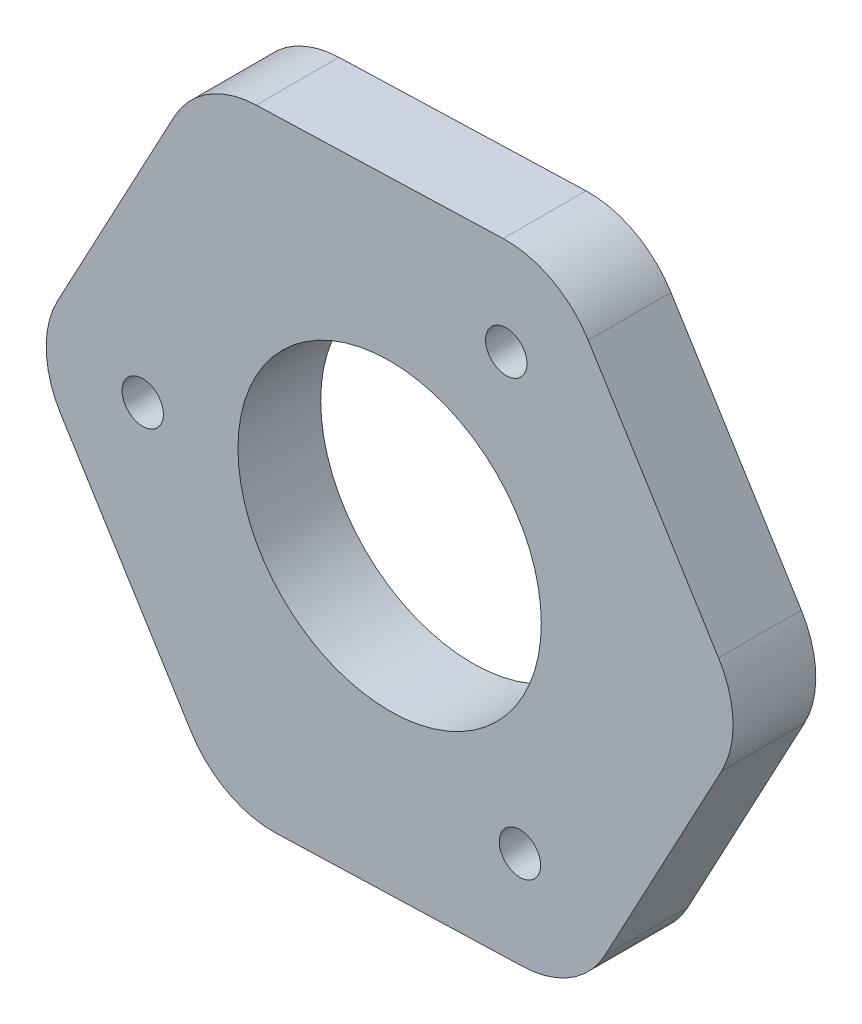
ISO-10303-21;
HEADER;
FILE_DESCRIPTION(('STEP AP214'),'2;1');
FILE_NAME('part.step','',(''),(''),'','','');
FILE_SCHEMA(('AUTOMOTIVE_DESIGN { 1 0 10303 214 1 1 1 1 }'));
ENDSEC;
DATA;
#1=APPLICATION_CONTEXT('core data for automotive mechanical design processes');
#2=APPLICATION_PROTOCOL_DEFINITION('international standard','automotive_design',2000,#1);
#3=PRODUCT_CONTEXT('',#1,'mechanical');
#4=PRODUCT('Part','Part','',(#3));
#5=PRODUCT_RELATED_PRODUCT_CATEGORY('part','',(#4));
#6=PRODUCT_DEFINITION_FORMATION('','',#4);
#7=PRODUCT_DEFINITION_CONTEXT('part definition',#1,'design');
#8=PRODUCT_DEFINITION('design','',#6,#7);
#9=PRODUCT_DEFINITION_SHAPE('','',#8);
#10=(LENGTH_UNIT() NAMED_UNIT(*) SI_UNIT(.MILLI.,.METRE.));
#11=(NAMED_UNIT(*) PLANE_ANGLE_UNIT() SI_UNIT($,.RADIAN.));
#12=(NAMED_UNIT(*) SI_UNIT($,.STERADIAN.) SOLID_ANGLE_UNIT());
#13=UNCERTAINTY_MEASURE_WITH_UNIT(LENGTH_MEASURE(1.E-05),#10,'distance_accuracy_value','');
#14=(GEOMETRIC_REPRESENTATION_CONTEXT(3) GLOBAL_UNCERTAINTY_ASSIGNED_CONTEXT((#13)) GLOBAL_UNIT_ASSIGNED_CONTEXT((#10,
#11,#12)) REPRESENTATION_CONTEXT('',''));
#15=CARTESIAN_POINT('',(0.,0.,0.));
#16=DIRECTION('',(0.,0.,1.));
#17=DIRECTION('',(1.,0.,0.));
#18=AXIS2_PLACEMENT_3D('',#15,#16,#17);
#19=CARTESIAN_POINT('',(30.4001110546183,357.597647719878,6.));
#20=DIRECTION('',(0.,0.,1.));
#21=DIRECTION('',(1.,0.,0.));
#22=AXIS2_PLACEMENT_3D('',#19,#20,#21);
#23=PLANE('',#22);
#24=CARTESIAN_POINT('',(56.7654750880517,373.96635541091,6.));
#25=DIRECTION('',(0.,0.,1.));
#26=DIRECTION('',(1.,0.,0.));
#27=AXIS2_PLACEMENT_3D('',#24,#25,#26);
#28=CIRCLE('',#27,1.49999999999958);
#29=CARTESIAN_POINT('',(58.2654750880513,373.96635541091,6.));
#30=VERTEX_POINT('',#29);
#31=EDGE_CURVE('E298',#30,#30,#28,.T.);
#32=ORIENTED_EDGE('',*,*,#31,.F.);
#33=EDGE_LOOP('',(#32));
#34=FACE_BOUND('',#33,.T.);
#35=CARTESIAN_POINT('',(57.7585097588884,342.948926532415,6.));
#36=DIRECTION('',(0.,0.,1.));
#37=DIRECTION('',(1.,0.,0.));
#38=AXIS2_PLACEMENT_3D('',#35,#36,#37);
#39=CIRCLE('',#38,1.50000000000005);
#40=CARTESIAN_POINT('',(59.2585097588884,342.948926532415,6.));
#41=VERTEX_POINT('',#40);
#42=EDGE_CURVE('E165',#41,#41,#39,.T.);
#43=ORIENTED_EDGE('',*,*,#42,.F.);
#44=EDGE_LOOP('',(#43));
#45=FACE_BOUND('',#44,.T.);
#46=CARTESIAN_POINT('',(30.4001110546183,357.597647719878,6.));
#47=DIRECTION('',(0.,0.,1.));
#48=DIRECTION('',(1.,0.,0.));
#49=AXIS2_PLACEMENT_3D('',#46,#47,#48);
#50=CIRCLE('',#49,7.00000000000114);
#51=CARTESIAN_POINT('',(24.229041224556,360.901871857632,6.));
#52=VERTEX_POINT('',#51);
#53=CARTESIAN_POINT('',(24.4530340964946,353.905456547395,6.));
#54=VERTEX_POINT('',#53);
#55=EDGE_CURVE('E184',#52,#54,#50,.T.);
#56=ORIENTED_EDGE('',*,*,#55,.T.);
#57=DIRECTION('',(0.527455881783461,-0.849582422588904,0.));
#58=VECTOR('',#57,1.);
#59=CARTESIAN_POINT('',(24.4530340964946,353.905456547395,6.));
#60=LINE('',#59,#58);
#61=CARTESIAN_POINT('',(33.9035118881977,338.68340652541,6.));
#62=VERTEX_POINT('',#61);
#63=EDGE_CURVE('E112',#54,#62,#60,.T.);
#64=ORIENTED_EDGE('',*,*,#63,.T.);
#65=CARTESIAN_POINT('',(39.8505888463207,342.375597697894,6.));
#66=DIRECTION('',(0.,0.,1.));
#67=DIRECTION('',(1.,0.,0.));
#68=AXIS2_PLACEMENT_3D('',#65,#66,#67);
#69=CIRCLE('',#68,7.00000000000067);
#70=CARTESIAN_POINT('',(40.0745817182586,335.379182387656,6.));
#71=VERTEX_POINT('',#70);
#72=EDGE_CURVE('E211',#62,#71,#69,.T.);
#73=ORIENTED_EDGE('',*,*,#72,.T.);
#74=DIRECTION('',(0.999487901462451,0.0319989817054624,0.));
#75=VECTOR('',#74,1.);
#76=CARTESIAN_POINT('',(40.0745817182587,335.379182387656,6.));
#77=LINE('',#76,#75);
#78=CARTESIAN_POINT('',(57.9825026308267,335.952511222178,6.));
#79=VERTEX_POINT('',#78);
#80=EDGE_CURVE('E230',#71,#79,#77,.T.);
#81=ORIENTED_EDGE('',*,*,#80,.T.);
#82=CARTESIAN_POINT('',(57.7585097588884,342.948926532415,6.));
#83=DIRECTION('',(0.,0.,1.));
#84=DIRECTION('',(1.,0.,0.));
#85=AXIS2_PLACEMENT_3D('',#82,#83,#84);
#86=CIRCLE('',#85,7.00000000000017);
#87=CARTESIAN_POINT('',(63.9295795889497,339.644702394662,6.));
#88=VERTEX_POINT('',#87);
#89=EDGE_CURVE('E227',#79,#88,#86,.T.);
#90=ORIENTED_EDGE('',*,*,#89,.T.);
#91=DIRECTION('',(0.472032019679086,0.881581404294398,0.));
#92=VECTOR('',#91,1.);
#93=CARTESIAN_POINT('',(63.9295795889496,339.644702394662,6.));
#94=LINE('',#93,#92);
#95=CARTESIAN_POINT('',(72.3870227098161,355.440081251169,6.));
#96=VERTEX_POINT('',#95);
#97=EDGE_CURVE('E229',#88,#96,#94,.T.);
#98=ORIENTED_EDGE('',*,*,#97,.T.);
#99=CARTESIAN_POINT('',(66.2159528797534,358.744305388923,6.));
#100=DIRECTION('',(0.,0.,1.));
#101=DIRECTION('',(1.,0.,0.));
#102=AXIS2_PLACEMENT_3D('',#99,#100,#101);
#103=CIRCLE('',#102,7.00000000000172);
#104=CARTESIAN_POINT('',(72.163029837878,362.436496561407,6.));
#105=VERTEX_POINT('',#104);
#106=EDGE_CURVE('E232',#96,#105,#103,.T.);
#107=ORIENTED_EDGE('',*,*,#106,.T.);
#108=DIRECTION('',(-0.527455881783443,0.849582422588916,0.));
#109=VECTOR('',#108,1.);
#110=CARTESIAN_POINT('',(72.163029837878,362.436496561407,6.));
#111=LINE('',#110,#109);
#112=CARTESIAN_POINT('',(62.7125520461742,377.658546583393,6.));
#113=VERTEX_POINT('',#112);
#114=EDGE_CURVE('E238',#105,#113,#111,.T.);
#115=ORIENTED_EDGE('',*,*,#114,.T.);
#116=CARTESIAN_POINT('',(56.7654750880518,373.966355410908,6.));
#117=DIRECTION('',(0.,0.,1.));
#118=DIRECTION('',(1.,0.,0.));
#119=AXIS2_PLACEMENT_3D('',#116,#117,#118);
#120=CIRCLE('',#119,7.00000000000107);
#121=CARTESIAN_POINT('',(56.5414822161133,380.962770721146,6.));
#122=VERTEX_POINT('',#121);
#123=EDGE_CURVE('E143',#113,#122,#120,.T.);
#124=ORIENTED_EDGE('',*,*,#123,.T.);
#125=DIRECTION('',(-0.99948790146245,-0.0319989817054965,0.));
#126=VECTOR('',#125,1.);
#127=CARTESIAN_POINT('',(56.5414822161133,380.962770721147,6.));
#128=LINE('',#127,#126);
#129=CARTESIAN_POINT('',(38.633561303547,380.389441886625,6.));
#130=VERTEX_POINT('',#129);
#131=EDGE_CURVE('E137',#122,#130,#128,.T.);
#132=ORIENTED_EDGE('',*,*,#131,.T.);
#133=CARTESIAN_POINT('',(38.8575541754844,373.393026576387,6.));
#134=DIRECTION('',(0.,0.,1.));
#135=DIRECTION('',(1.,0.,0.));
#136=AXIS2_PLACEMENT_3D('',#133,#134,#135);
#137=CIRCLE('',#136,7.00000000000034);
#138=CARTESIAN_POINT('',(32.6864843454236,376.697250714141,6.));
#139=VERTEX_POINT('',#138);
#140=EDGE_CURVE('E141',#130,#139,#137,.T.);
#141=ORIENTED_EDGE('',*,*,#140,.T.);
#142=DIRECTION('',(-0.472032019679114,-0.881581404294383,0.));
#143=VECTOR('',#142,1.);
#144=CARTESIAN_POINT('',(32.6864843454239,376.697250714141,6.));
#145=LINE('',#144,#143);
#146=EDGE_CURVE('E57',#139,#52,#145,.T.);
#147=ORIENTED_EDGE('',*,*,#146,.T.);
#148=EDGE_LOOP('',(#56,#64,#73,#81,#90,#98,#107,#115,#124,#132,#141,#147));
#149=FACE_BOUND('',#148,.T.);
#150=CARTESIAN_POINT('',(48.3080319671867,358.170976554401,6.));
#151=DIRECTION('',(0.,0.,1.));
#152=DIRECTION('',(1.,0.,0.));
#153=AXIS2_PLACEMENT_3D('',#150,#151,#152);
#154=CIRCLE('',#153,10.999999999999);
#155=CARTESIAN_POINT('',(59.3080319671857,358.170976554401,6.));
#156=VERTEX_POINT('',#155);
#157=EDGE_CURVE('E304',#156,#156,#154,.T.);
#158=ORIENTED_EDGE('',*,*,#157,.F.);
#159=EDGE_LOOP('',(#158));
#160=FACE_BOUND('',#159,.T.);
#161=CARTESIAN_POINT('',(30.4001110546172,357.597647719879,6.));
#162=DIRECTION('',(0.,0.,1.));
#163=DIRECTION('',(1.,0.,0.));
#164=AXIS2_PLACEMENT_3D('',#161,#162,#163);
#165=CIRCLE('',#164,1.50000000000103);
#166=CARTESIAN_POINT('',(31.9001110546183,357.597647719879,6.));
#167=VERTEX_POINT('',#166);
#168=EDGE_CURVE('E289',#167,#167,#165,.T.);
#169=ORIENTED_EDGE('',*,*,#168,.F.);
#170=EDGE_LOOP('',(#169));
#171=FACE_BOUND('',#170,.T.);
#172=ADVANCED_FACE('F40',(#34,#45,#149,#160,#171),#23,.T.);
#173=CARTESIAN_POINT('',(30.4001110546183,357.597647719878,0.));
#174=DIRECTION('',(0.,0.,1.));
#175=DIRECTION('',(1.,0.,0.));
#176=AXIS2_PLACEMENT_3D('',#173,#174,#175);
#177=PLANE('',#176);
#178=CARTESIAN_POINT('',(30.4001110546183,357.597647719878,0.));
#179=DIRECTION('',(0.,0.,1.));
#180=DIRECTION('',(1.,0.,0.));
#181=AXIS2_PLACEMENT_3D('',#178,#179,#180);
#182=CIRCLE('',#181,7.00000000000114);
#183=CARTESIAN_POINT('',(24.229041224556,360.901871857632,0.));
#184=VERTEX_POINT('',#183);
#185=CARTESIAN_POINT('',(24.4530340964946,353.905456547395,0.));
#186=VERTEX_POINT('',#185);
#187=EDGE_CURVE('E161',#184,#186,#182,.T.);
#188=ORIENTED_EDGE('',*,*,#187,.F.);
#189=DIRECTION('',(-0.472032019679114,-0.881581404294383,0.));
#190=VECTOR('',#189,1.);
#191=CARTESIAN_POINT('',(32.6864843454239,376.697250714141,0.));
#192=LINE('',#191,#190);
#193=CARTESIAN_POINT('',(32.6864843454236,376.697250714141,0.));
#194=VERTEX_POINT('',#193);
#195=EDGE_CURVE('E104',#194,#184,#192,.T.);
#196=ORIENTED_EDGE('',*,*,#195,.F.);
#197=CARTESIAN_POINT('',(38.8575541754844,373.393026576387,0.));
#198=DIRECTION('',(0.,0.,1.));
#199=DIRECTION('',(1.,0.,0.));
#200=AXIS2_PLACEMENT_3D('',#197,#198,#199);
#201=CIRCLE('',#200,7.00000000000034);
#202=CARTESIAN_POINT('',(38.633561303547,380.389441886625,0.));
#203=VERTEX_POINT('',#202);
#204=EDGE_CURVE('E98',#203,#194,#201,.T.);
#205=ORIENTED_EDGE('',*,*,#204,.F.);
#206=DIRECTION('',(-0.99948790146245,-0.0319989817054965,0.));
#207=VECTOR('',#206,1.);
#208=CARTESIAN_POINT('',(56.5414822161133,380.962770721147,0.));
#209=LINE('',#208,#207);
#210=CARTESIAN_POINT('',(56.5414822161133,380.962770721146,0.));
#211=VERTEX_POINT('',#210);
#212=EDGE_CURVE('E151',#211,#203,#209,.T.);
#213=ORIENTED_EDGE('',*,*,#212,.F.);
#214=CARTESIAN_POINT('',(56.7654750880518,373.966355410908,0.));
#215=DIRECTION('',(0.,0.,1.));
#216=DIRECTION('',(1.,0.,0.));
#217=AXIS2_PLACEMENT_3D('',#214,#215,#216);
#218=CIRCLE('',#217,7.00000000000107);
#219=CARTESIAN_POINT('',(62.7125520461742,377.658546583393,0.));
#220=VERTEX_POINT('',#219);
#221=EDGE_CURVE('E179',#220,#211,#218,.T.);
#222=ORIENTED_EDGE('',*,*,#221,.F.);
#223=DIRECTION('',(-0.527455881783443,0.849582422588916,0.));
#224=VECTOR('',#223,1.);
#225=CARTESIAN_POINT('',(72.163029837878,362.436496561407,0.));
#226=LINE('',#225,#224);
#227=CARTESIAN_POINT('',(72.163029837878,362.436496561407,0.));
#228=VERTEX_POINT('',#227);
#229=EDGE_CURVE('E177',#228,#220,#226,.T.);
#230=ORIENTED_EDGE('',*,*,#229,.F.);
#231=CARTESIAN_POINT('',(66.2159528797534,358.744305388923,0.));
#232=DIRECTION('',(0.,0.,1.));
#233=DIRECTION('',(1.,0.,0.));
#234=AXIS2_PLACEMENT_3D('',#231,#232,#233);
#235=CIRCLE('',#234,7.00000000000172);
#236=CARTESIAN_POINT('',(72.3870227098161,355.440081251169,0.));
#237=VERTEX_POINT('',#236);
#238=EDGE_CURVE('E175',#237,#228,#235,.T.);
#239=ORIENTED_EDGE('',*,*,#238,.F.);
#240=DIRECTION('',(0.472032019679086,0.881581404294398,0.));
#241=VECTOR('',#240,1.);
#242=CARTESIAN_POINT('',(63.9295795889496,339.644702394662,0.));
#243=LINE('',#242,#241);
#244=CARTESIAN_POINT('',(63.9295795889497,339.644702394662,0.));
#245=VERTEX_POINT('',#244);
#246=EDGE_CURVE('E173',#245,#237,#243,.T.);
#247=ORIENTED_EDGE('',*,*,#246,.F.);
#248=CARTESIAN_POINT('',(57.7585097588884,342.948926532415,0.));
#249=DIRECTION('',(0.,0.,1.));
#250=DIRECTION('',(1.,0.,0.));
#251=AXIS2_PLACEMENT_3D('',#248,#249,#250);
#252=CIRCLE('',#251,7.00000000000017);
#253=CARTESIAN_POINT('',(57.9825026308267,335.952511222178,0.));
#254=VERTEX_POINT('',#253);
#255=EDGE_CURVE('E171',#254,#245,#252,.T.);
#256=ORIENTED_EDGE('',*,*,#255,.F.);
#257=DIRECTION('',(0.999487901462451,0.0319989817054624,0.));
#258=VECTOR('',#257,1.);
#259=CARTESIAN_POINT('',(40.0745817182587,335.379182387656,0.));
#260=LINE('',#259,#258);
#261=CARTESIAN_POINT('',(40.0745817182586,335.379182387656,0.));
#262=VERTEX_POINT('',#261);
#263=EDGE_CURVE('E169',#262,#254,#260,.T.);
#264=ORIENTED_EDGE('',*,*,#263,.F.);
#265=CARTESIAN_POINT('',(39.8505888463207,342.375597697894,0.));
#266=DIRECTION('',(0.,0.,1.));
#267=DIRECTION('',(1.,0.,0.));
#268=AXIS2_PLACEMENT_3D('',#265,#266,#267);
#269=CIRCLE('',#268,7.00000000000067);
#270=CARTESIAN_POINT('',(33.9035118881977,338.68340652541,0.));
#271=VERTEX_POINT('',#270);
#272=EDGE_CURVE('E167',#271,#262,#269,.T.);
#273=ORIENTED_EDGE('',*,*,#272,.F.);
#274=DIRECTION('',(0.527455881783461,-0.849582422588904,0.));
#275=VECTOR('',#274,1.);
#276=CARTESIAN_POINT('',(24.4530340964946,353.905456547395,0.));
#277=LINE('',#276,#275);
#278=EDGE_CURVE('E164',#186,#271,#277,.T.);
#279=ORIENTED_EDGE('',*,*,#278,.F.);
#280=EDGE_LOOP('',(#188,#196,#205,#213,#222,#230,#239,#247,#256,#264,#273,#279));
#281=FACE_BOUND('',#280,.T.);
#282=CARTESIAN_POINT('',(57.7585097588884,342.948926532415,0.));
#283=DIRECTION('',(0.,0.,1.));
#284=DIRECTION('',(1.,0.,0.));
#285=AXIS2_PLACEMENT_3D('',#282,#283,#284);
#286=CIRCLE('',#285,1.50000000000005);
#287=CARTESIAN_POINT('',(59.2585097588884,342.948926532415,0.));
#288=VERTEX_POINT('',#287);
#289=EDGE_CURVE('E307',#288,#288,#286,.T.);
#290=ORIENTED_EDGE('',*,*,#289,.T.);
#291=EDGE_LOOP('',(#290));
#292=FACE_BOUND('',#291,.T.);
#293=CARTESIAN_POINT('',(48.3080319671867,358.170976554401,0.));
#294=DIRECTION('',(0.,0.,1.));
#295=DIRECTION('',(1.,0.,0.));
#296=AXIS2_PLACEMENT_3D('',#293,#294,#295);
#297=CIRCLE('',#296,10.999999999999);
#298=CARTESIAN_POINT('',(59.3080319671857,358.170976554401,0.));
#299=VERTEX_POINT('',#298);
#300=EDGE_CURVE('E301',#299,#299,#297,.T.);
#301=ORIENTED_EDGE('',*,*,#300,.T.);
#302=EDGE_LOOP('',(#301));
#303=FACE_BOUND('',#302,.T.);
#304=CARTESIAN_POINT('',(56.7654750880517,373.96635541091,0.));
#305=DIRECTION('',(0.,0.,1.));
#306=DIRECTION('',(1.,0.,0.));
#307=AXIS2_PLACEMENT_3D('',#304,#305,#306);
#308=CIRCLE('',#307,1.49999999999958);
#309=CARTESIAN_POINT('',(58.2654750880513,373.96635541091,0.));
#310=VERTEX_POINT('',#309);
#311=EDGE_CURVE('E295',#310,#310,#308,.T.);
#312=ORIENTED_EDGE('',*,*,#311,.T.);
#313=EDGE_LOOP('',(#312));
#314=FACE_BOUND('',#313,.T.);
#315=CARTESIAN_POINT('',(30.4001110546172,357.597647719879,0.));
#316=DIRECTION('',(0.,0.,1.));
#317=DIRECTION('',(1.,0.,0.));
#318=AXIS2_PLACEMENT_3D('',#315,#316,#317);
#319=CIRCLE('',#318,1.50000000000103);
#320=CARTESIAN_POINT('',(31.9001110546183,357.597647719879,0.));
#321=VERTEX_POINT('',#320);
#322=EDGE_CURVE('E292',#321,#321,#319,.T.);
#323=ORIENTED_EDGE('',*,*,#322,.T.);
#324=EDGE_LOOP('',(#323));
#325=FACE_BOUND('',#324,.T.);
#326=ADVANCED_FACE('F215',(#281,#292,#303,#314,#325),#177,.F.);
#327=CARTESIAN_POINT('',(30.4001110546183,357.597647719878,6.));
#328=DIRECTION('',(0.,0.,-1.));
#329=DIRECTION('',(-1.,0.,0.));
#330=AXIS2_PLACEMENT_3D('',#327,#328,#329);
#331=CYLINDRICAL_SURFACE('',#330,7.00000000000114);
#332=ORIENTED_EDGE('',*,*,#187,.T.);
#333=DIRECTION('',(0.,0.,-1.));
#334=VECTOR('',#333,1.);
#335=CARTESIAN_POINT('',(24.4530340964946,353.905456547395,6.));
#336=LINE('',#335,#334);
#337=EDGE_CURVE('E11',#54,#186,#336,.T.);
#338=ORIENTED_EDGE('',*,*,#337,.F.);
#339=ORIENTED_EDGE('',*,*,#55,.F.);
#340=DIRECTION('',(0.,0.,-1.));
#341=VECTOR('',#340,1.);
#342=CARTESIAN_POINT('',(24.229041224556,360.901871857632,6.));
#343=LINE('',#342,#341);
#344=EDGE_CURVE('E157',#52,#184,#343,.T.);
#345=ORIENTED_EDGE('',*,*,#344,.T.);
#346=EDGE_LOOP('',(#332,#338,#339,#345));
#347=FACE_BOUND('',#346,.T.);
#348=ADVANCED_FACE('F42',(#347),#331,.T.);
#349=CARTESIAN_POINT('',(24.4530340964946,353.905456547395,6.));
#350=DIRECTION('',(0.849582422588904,0.527455881783461,0.));
#351=DIRECTION('',(-0.527455881783461,0.849582422588904,0.));
#352=AXIS2_PLACEMENT_3D('',#349,#350,#351);
#353=PLANE('',#352);
#354=ORIENTED_EDGE('',*,*,#278,.T.);
#355=DIRECTION('',(0.,0.,-1.));
#356=VECTOR('',#355,1.);
#357=CARTESIAN_POINT('',(33.9035118881977,338.68340652541,6.));
#358=LINE('',#357,#356);
#359=EDGE_CURVE('E49',#62,#271,#358,.T.);
#360=ORIENTED_EDGE('',*,*,#359,.F.);
#361=ORIENTED_EDGE('',*,*,#63,.F.);
#362=ORIENTED_EDGE('',*,*,#337,.T.);
#363=EDGE_LOOP('',(#354,#360,#361,#362));
#364=FACE_BOUND('',#363,.T.);
#365=ADVANCED_FACE('F427',(#364),#353,.F.);
#366=CARTESIAN_POINT('',(39.8505888463207,342.375597697894,6.));
#367=DIRECTION('',(0.,0.,-1.));
#368=DIRECTION('',(-1.,0.,0.));
#369=AXIS2_PLACEMENT_3D('',#366,#367,#368);
#370=CYLINDRICAL_SURFACE('',#369,7.00000000000067);
#371=ORIENTED_EDGE('',*,*,#272,.T.);
#372=DIRECTION('',(0.,0.,-1.));
#373=VECTOR('',#372,1.);
#374=CARTESIAN_POINT('',(40.0745817182586,335.379182387656,6.));
#375=LINE('',#374,#373);
#376=EDGE_CURVE('E203',#71,#262,#375,.T.);
#377=ORIENTED_EDGE('',*,*,#376,.F.);
#378=ORIENTED_EDGE('',*,*,#72,.F.);
#379=ORIENTED_EDGE('',*,*,#359,.T.);
#380=EDGE_LOOP('',(#371,#377,#378,#379));
#381=FACE_BOUND('',#380,.T.);
#382=ADVANCED_FACE('F209',(#381),#370,.T.);
#383=CARTESIAN_POINT('',(40.0745817182587,335.379182387656,6.));
#384=DIRECTION('',(-0.0319989817054624,0.999487901462451,0.));
#385=DIRECTION('',(-0.999487901462451,-0.0319989817054624,0.));
#386=AXIS2_PLACEMENT_3D('',#383,#384,#385);
#387=PLANE('',#386);
#388=ORIENTED_EDGE('',*,*,#263,.T.);
#389=DIRECTION('',(0.,0.,-1.));
#390=VECTOR('',#389,1.);
#391=CARTESIAN_POINT('',(57.9825026308267,335.952511222178,6.));
#392=LINE('',#391,#390);
#393=EDGE_CURVE('E200',#79,#254,#392,.T.);
#394=ORIENTED_EDGE('',*,*,#393,.F.);
#395=ORIENTED_EDGE('',*,*,#80,.F.);
#396=ORIENTED_EDGE('',*,*,#376,.T.);
#397=EDGE_LOOP('',(#388,#394,#395,#396));
#398=FACE_BOUND('',#397,.T.);
#399=ADVANCED_FACE('F221',(#398),#387,.F.);
#400=CARTESIAN_POINT('',(57.7585097588884,342.948926532415,6.));
#401=DIRECTION('',(0.,0.,-1.));
#402=DIRECTION('',(-1.,0.,0.));
#403=AXIS2_PLACEMENT_3D('',#400,#401,#402);
#404=CYLINDRICAL_SURFACE('',#403,7.00000000000017);
#405=ORIENTED_EDGE('',*,*,#255,.T.);
#406=DIRECTION('',(0.,0.,-1.));
#407=VECTOR('',#406,1.);
#408=CARTESIAN_POINT('',(63.9295795889497,339.644702394662,6.));
#409=LINE('',#408,#407);
#410=EDGE_CURVE('E197',#88,#245,#409,.T.);
#411=ORIENTED_EDGE('',*,*,#410,.F.);
#412=ORIENTED_EDGE('',*,*,#89,.F.);
#413=ORIENTED_EDGE('',*,*,#393,.T.);
#414=EDGE_LOOP('',(#405,#411,#412,#413));
#415=FACE_BOUND('',#414,.T.);
#416=ADVANCED_FACE('F225',(#415),#404,.T.);
#417=CARTESIAN_POINT('',(63.9295795889496,339.644702394662,6.));
#418=DIRECTION('',(-0.881581404294398,0.472032019679086,0.));
#419=DIRECTION('',(-0.472032019679086,-0.881581404294398,0.));
#420=AXIS2_PLACEMENT_3D('',#417,#418,#419);
#421=PLANE('',#420);
#422=ORIENTED_EDGE('',*,*,#246,.T.);
#423=DIRECTION('',(0.,0.,-1.));
#424=VECTOR('',#423,1.);
#425=CARTESIAN_POINT('',(72.3870227098161,355.440081251169,6.));
#426=LINE('',#425,#424);
#427=EDGE_CURVE('E194',#96,#237,#426,.T.);
#428=ORIENTED_EDGE('',*,*,#427,.F.);
#429=ORIENTED_EDGE('',*,*,#97,.F.);
#430=ORIENTED_EDGE('',*,*,#410,.T.);
#431=EDGE_LOOP('',(#422,#428,#429,#430));
#432=FACE_BOUND('',#431,.T.);
#433=ADVANCED_FACE('F388',(#432),#421,.F.);
#434=CARTESIAN_POINT('',(66.2159528797534,358.744305388923,6.));
#435=DIRECTION('',(0.,0.,-1.));
#436=DIRECTION('',(-1.,0.,0.));
#437=AXIS2_PLACEMENT_3D('',#434,#435,#436);
#438=CYLINDRICAL_SURFACE('',#437,7.00000000000172);
#439=ORIENTED_EDGE('',*,*,#238,.T.);
#440=DIRECTION('',(0.,0.,-1.));
#441=VECTOR('',#440,1.);
#442=CARTESIAN_POINT('',(72.163029837878,362.436496561407,6.));
#443=LINE('',#442,#441);
#444=EDGE_CURVE('E191',#105,#228,#443,.T.);
#445=ORIENTED_EDGE('',*,*,#444,.F.);
#446=ORIENTED_EDGE('',*,*,#106,.F.);
#447=ORIENTED_EDGE('',*,*,#427,.T.);
#448=EDGE_LOOP('',(#439,#445,#446,#447));
#449=FACE_BOUND('',#448,.T.);
#450=ADVANCED_FACE('F378',(#449),#438,.T.);
#451=CARTESIAN_POINT('',(72.163029837878,362.436496561407,6.));
#452=DIRECTION('',(-0.849582422588916,-0.527455881783443,0.));
#453=DIRECTION('',(0.527455881783443,-0.849582422588916,0.));
#454=AXIS2_PLACEMENT_3D('',#451,#452,#453);
#455=PLANE('',#454);
#456=ORIENTED_EDGE('',*,*,#229,.T.);
#457=DIRECTION('',(0.,0.,-1.));
#458=VECTOR('',#457,1.);
#459=CARTESIAN_POINT('',(62.7125520461742,377.658546583393,6.));
#460=LINE('',#459,#458);
#461=EDGE_CURVE('E188',#113,#220,#460,.T.);
#462=ORIENTED_EDGE('',*,*,#461,.F.);
#463=ORIENTED_EDGE('',*,*,#114,.F.);
#464=ORIENTED_EDGE('',*,*,#444,.T.);
#465=EDGE_LOOP('',(#456,#462,#463,#464));
#466=FACE_BOUND('',#465,.T.);
#467=ADVANCED_FACE('F244',(#466),#455,.F.);
#468=CARTESIAN_POINT('',(56.7654750880518,373.966355410908,6.));
#469=DIRECTION('',(0.,0.,-1.));
#470=DIRECTION('',(-1.,0.,0.));
#471=AXIS2_PLACEMENT_3D('',#468,#469,#470);
#472=CYLINDRICAL_SURFACE('',#471,7.00000000000107);
#473=ORIENTED_EDGE('',*,*,#221,.T.);
#474=DIRECTION('',(0.,0.,-1.));
#475=VECTOR('',#474,1.);
#476=CARTESIAN_POINT('',(56.5414822161133,380.962770721146,6.));
#477=LINE('',#476,#475);
#478=EDGE_CURVE('E152',#122,#211,#477,.T.);
#479=ORIENTED_EDGE('',*,*,#478,.F.);
#480=ORIENTED_EDGE('',*,*,#123,.F.);
#481=ORIENTED_EDGE('',*,*,#461,.T.);
#482=EDGE_LOOP('',(#473,#479,#480,#481));
#483=FACE_BOUND('',#482,.T.);
#484=ADVANCED_FACE('F248',(#483),#472,.T.);
#485=CARTESIAN_POINT('',(56.5414822161133,380.962770721147,6.));
#486=DIRECTION('',(0.0319989817054965,-0.999487901462449,0.));
#487=DIRECTION('',(0.99948790146245,0.0319989817054965,0.));
#488=AXIS2_PLACEMENT_3D('',#485,#486,#487);
#489=PLANE('',#488);
#490=ORIENTED_EDGE('',*,*,#212,.T.);
#491=DIRECTION('',(0.,0.,-1.));
#492=VECTOR('',#491,1.);
#493=CARTESIAN_POINT('',(38.633561303547,380.389441886625,6.));
#494=LINE('',#493,#492);
#495=EDGE_CURVE('E148',#130,#203,#494,.T.);
#496=ORIENTED_EDGE('',*,*,#495,.F.);
#497=ORIENTED_EDGE('',*,*,#131,.F.);
#498=ORIENTED_EDGE('',*,*,#478,.T.);
#499=EDGE_LOOP('',(#490,#496,#497,#498));
#500=FACE_BOUND('',#499,.T.);
#501=ADVANCED_FACE('F149',(#500),#489,.F.);
#502=CARTESIAN_POINT('',(38.8575541754844,373.393026576387,6.));
#503=DIRECTION('',(0.,0.,-1.));
#504=DIRECTION('',(-1.,0.,0.));
#505=AXIS2_PLACEMENT_3D('',#502,#503,#504);
#506=CYLINDRICAL_SURFACE('',#505,7.00000000000034);
#507=ORIENTED_EDGE('',*,*,#204,.T.);
#508=DIRECTION('',(0.,0.,-1.));
#509=VECTOR('',#508,1.);
#510=CARTESIAN_POINT('',(32.6864843454236,376.697250714141,6.));
#511=LINE('',#510,#509);
#512=EDGE_CURVE('E153',#139,#194,#511,.T.);
#513=ORIENTED_EDGE('',*,*,#512,.F.);
#514=ORIENTED_EDGE('',*,*,#140,.F.);
#515=ORIENTED_EDGE('',*,*,#495,.T.);
#516=EDGE_LOOP('',(#507,#513,#514,#515));
#517=FACE_BOUND('',#516,.T.);
#518=ADVANCED_FACE('F155',(#517),#506,.T.);
#519=CARTESIAN_POINT('',(32.6864843454239,376.697250714141,6.));
#520=DIRECTION('',(0.881581404294383,-0.472032019679114,0.));
#521=DIRECTION('',(0.472032019679114,0.881581404294383,0.));
#522=AXIS2_PLACEMENT_3D('',#519,#520,#521);
#523=PLANE('',#522);
#524=ORIENTED_EDGE('',*,*,#195,.T.);
#525=ORIENTED_EDGE('',*,*,#344,.F.);
#526=ORIENTED_EDGE('',*,*,#146,.F.);
#527=ORIENTED_EDGE('',*,*,#512,.T.);
#528=EDGE_LOOP('',(#524,#525,#526,#527));
#529=FACE_BOUND('',#528,.T.);
#530=ADVANCED_FACE('F252',(#529),#523,.F.);
#531=CARTESIAN_POINT('',(57.7585097588884,342.948926532415,6.));
#532=DIRECTION('',(0.,0.,-1.));
#533=DIRECTION('',(-1.,0.,0.));
#534=AXIS2_PLACEMENT_3D('',#531,#532,#533);
#535=CYLINDRICAL_SURFACE('',#534,1.50000000000005);
#536=ORIENTED_EDGE('',*,*,#42,.T.);
#537=EDGE_LOOP('',(#536));
#538=FACE_BOUND('',#537,.T.);
#539=ORIENTED_EDGE('',*,*,#289,.F.);
#540=EDGE_LOOP('',(#539));
#541=FACE_BOUND('',#540,.T.);
#542=ADVANCED_FACE('F254',(#538,#541),#535,.F.);
#543=CARTESIAN_POINT('',(48.3080319671867,358.170976554401,6.));
#544=DIRECTION('',(0.,0.,-1.));
#545=DIRECTION('',(-1.,0.,0.));
#546=AXIS2_PLACEMENT_3D('',#543,#544,#545);
#547=CYLINDRICAL_SURFACE('',#546,10.999999999999);
#548=ORIENTED_EDGE('',*,*,#157,.T.);
#549=EDGE_LOOP('',(#548));
#550=FACE_BOUND('',#549,.T.);
#551=ORIENTED_EDGE('',*,*,#300,.F.);
#552=EDGE_LOOP('',(#551));
#553=FACE_BOUND('',#552,.T.);
#554=ADVANCED_FACE('F260',(#550,#553),#547,.F.);
#555=CARTESIAN_POINT('',(56.7654750880517,373.96635541091,6.));
#556=DIRECTION('',(0.,0.,-1.));
#557=DIRECTION('',(-1.,0.,0.));
#558=AXIS2_PLACEMENT_3D('',#555,#556,#557);
#559=CYLINDRICAL_SURFACE('',#558,1.49999999999958);
#560=ORIENTED_EDGE('',*,*,#31,.T.);
#561=EDGE_LOOP('',(#560));
#562=FACE_BOUND('',#561,.T.);
#563=ORIENTED_EDGE('',*,*,#311,.F.);
#564=EDGE_LOOP('',(#563));
#565=FACE_BOUND('',#564,.T.);
#566=ADVANCED_FACE('F276',(#562,#565),#559,.F.);
#567=CARTESIAN_POINT('',(30.4001110546172,357.597647719879,6.));
#568=DIRECTION('',(0.,0.,-1.));
#569=DIRECTION('',(-1.,0.,0.));
#570=AXIS2_PLACEMENT_3D('',#567,#568,#569);
#571=CYLINDRICAL_SURFACE('',#570,1.50000000000103);
#572=ORIENTED_EDGE('',*,*,#168,.T.);
#573=EDGE_LOOP('',(#572));
#574=FACE_BOUND('',#573,.T.);
#575=ORIENTED_EDGE('',*,*,#322,.F.);
#576=EDGE_LOOP('',(#575));
#577=FACE_BOUND('',#576,.T.);
#578=ADVANCED_FACE('F280',(#574,#577),#571,.F.);
#579=CLOSED_SHELL('',(#172,#326,#348,#365,#382,#399,#416,#433,#450,#467,#484,#501,#518,#530,
#542,#554,#566,#578));
#580=MANIFOLD_SOLID_BREP('B2',#579);
#581=ADVANCED_BREP_SHAPE_REPRESENTATION('',(#18,#580),#14);
#582=SHAPE_DEFINITION_REPRESENTATION(#9,#581);
ENDSEC;
END-ISO-10303-21;
